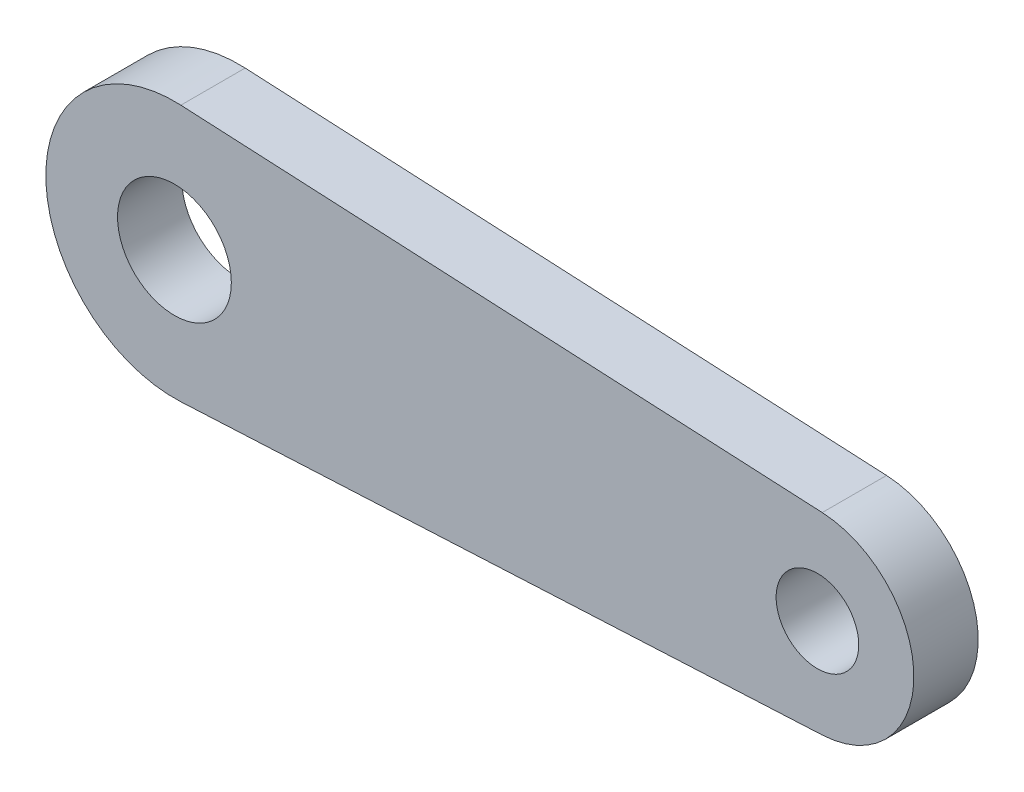
ISO-10303-21;
HEADER;
FILE_DESCRIPTION(('STEP AP214'),'2;1');
FILE_NAME('part.step','',(''),(''),'','','');
FILE_SCHEMA(('AUTOMOTIVE_DESIGN { 1 0 10303 214 1 1 1 1 }'));
ENDSEC;
DATA;
#1=APPLICATION_CONTEXT('core data for automotive mechanical design processes');
#2=APPLICATION_PROTOCOL_DEFINITION('international standard','automotive_design',2000,#1);
#3=PRODUCT_CONTEXT('',#1,'mechanical');
#4=PRODUCT('Part','Part','',(#3));
#5=PRODUCT_RELATED_PRODUCT_CATEGORY('part','',(#4));
#6=PRODUCT_DEFINITION_FORMATION('','',#4);
#7=PRODUCT_DEFINITION_CONTEXT('part definition',#1,'design');
#8=PRODUCT_DEFINITION('design','',#6,#7);
#9=PRODUCT_DEFINITION_SHAPE('','',#8);
#10=(LENGTH_UNIT() NAMED_UNIT(*) SI_UNIT(.MILLI.,.METRE.));
#11=(NAMED_UNIT(*) PLANE_ANGLE_UNIT() SI_UNIT($,.RADIAN.));
#12=(NAMED_UNIT(*) SI_UNIT($,.STERADIAN.) SOLID_ANGLE_UNIT());
#13=UNCERTAINTY_MEASURE_WITH_UNIT(LENGTH_MEASURE(1.E-05),#10,'distance_accuracy_value','');
#14=(GEOMETRIC_REPRESENTATION_CONTEXT(3) GLOBAL_UNCERTAINTY_ASSIGNED_CONTEXT((#13)) GLOBAL_UNIT_ASSIGNED_CONTEXT((#10,
#11,#12)) REPRESENTATION_CONTEXT('',''));
#15=CARTESIAN_POINT('',(0.,0.,0.));
#16=DIRECTION('',(0.,0.,1.));
#17=DIRECTION('',(1.,0.,0.));
#18=AXIS2_PLACEMENT_3D('',#15,#16,#17);
#19=CARTESIAN_POINT('',(25.4,0.,2.54));
#20=DIRECTION('',(0.,0.,-1.));
#21=DIRECTION('',(-1.,0.,0.));
#22=AXIS2_PLACEMENT_3D('',#19,#20,#21);
#23=PLANE('',#22);
#24=CARTESIAN_POINT('',(0.,0.,2.54));
#25=DIRECTION('',(0.,0.,1.));
#26=DIRECTION('',(1.,0.,0.));
#27=AXIS2_PLACEMENT_3D('',#24,#25,#26);
#28=CIRCLE('',#27,2.24789999999999);
#29=CARTESIAN_POINT('',(2.24789999999999,0.,2.54));
#30=VERTEX_POINT('',#29);
#31=EDGE_CURVE('E113',#30,#30,#28,.T.);
#32=ORIENTED_EDGE('',*,*,#31,.F.);
#33=EDGE_LOOP('',(#32));
#34=FACE_BOUND('',#33,.T.);
#35=CARTESIAN_POINT('',(25.4,0.,2.54));
#36=DIRECTION('',(0.,0.,1.));
#37=DIRECTION('',(-1.,0.,0.));
#38=AXIS2_PLACEMENT_3D('',#35,#36,#37);
#39=CIRCLE('',#38,3.81);
#40=CARTESIAN_POINT('',(25.5905,-3.80523451971097,2.54));
#41=VERTEX_POINT('',#40);
#42=CARTESIAN_POINT('',(25.5905,3.80523451971097,2.54));
#43=VERTEX_POINT('',#42);
#44=EDGE_CURVE('E85',#41,#43,#39,.T.);
#45=ORIENTED_EDGE('',*,*,#44,.T.);
#46=DIRECTION('',(-0.998749217771909,0.0500000000000001,0.));
#47=VECTOR('',#46,1.);
#48=CARTESIAN_POINT('',(0.254,5.0736460262813,2.54));
#49=LINE('',#48,#47);
#50=CARTESIAN_POINT('',(0.254000000000001,5.0736460262813,2.54));
#51=VERTEX_POINT('',#50);
#52=EDGE_CURVE('E80',#43,#51,#49,.T.);
#53=ORIENTED_EDGE('',*,*,#52,.T.);
#54=CARTESIAN_POINT('',(0.,0.,2.54));
#55=DIRECTION('',(0.,0.,1.));
#56=DIRECTION('',(1.,0.,0.));
#57=AXIS2_PLACEMENT_3D('',#54,#55,#56);
#58=CIRCLE('',#57,5.08);
#59=CARTESIAN_POINT('',(0.254,-5.0736460262813,2.54));
#60=VERTEX_POINT('',#59);
#61=EDGE_CURVE('E83',#51,#60,#58,.T.);
#62=ORIENTED_EDGE('',*,*,#61,.T.);
#63=DIRECTION('',(0.998749217771909,0.0500000000000001,0.));
#64=VECTOR('',#63,1.);
#65=CARTESIAN_POINT('',(0.254,-5.0736460262813,2.54));
#66=LINE('',#65,#64);
#67=EDGE_CURVE('E50',#60,#41,#66,.T.);
#68=ORIENTED_EDGE('',*,*,#67,.T.);
#69=EDGE_LOOP('',(#45,#53,#62,#68));
#70=FACE_BOUND('',#69,.T.);
#71=CARTESIAN_POINT('',(25.4,0.,2.54));
#72=DIRECTION('',(0.,0.,1.));
#73=DIRECTION('',(1.,0.,0.));
#74=AXIS2_PLACEMENT_3D('',#71,#72,#73);
#75=CIRCLE('',#74,1.63195);
#76=CARTESIAN_POINT('',(27.03195,0.,2.54));
#77=VERTEX_POINT('',#76);
#78=EDGE_CURVE('E119',#77,#77,#75,.T.);
#79=ORIENTED_EDGE('',*,*,#78,.F.);
#80=EDGE_LOOP('',(#79));
#81=FACE_BOUND('',#80,.T.);
#82=ADVANCED_FACE('F33',(#34,#70,#81),#23,.F.);
#83=CARTESIAN_POINT('',(25.4,0.,2.54));
#84=DIRECTION('',(0.,0.,-1.));
#85=DIRECTION('',(-1.,0.,0.));
#86=AXIS2_PLACEMENT_3D('',#83,#84,#85);
#87=CYLINDRICAL_SURFACE('',#86,3.81);
#88=CARTESIAN_POINT('',(25.4,0.,0.));
#89=DIRECTION('',(0.,0.,1.));
#90=DIRECTION('',(-1.,0.,0.));
#91=AXIS2_PLACEMENT_3D('',#88,#89,#90);
#92=CIRCLE('',#91,3.81);
#93=CARTESIAN_POINT('',(25.5905,-3.80523451971097,0.));
#94=VERTEX_POINT('',#93);
#95=CARTESIAN_POINT('',(25.5905,3.80523451971097,0.));
#96=VERTEX_POINT('',#95);
#97=EDGE_CURVE('E97',#94,#96,#92,.T.);
#98=ORIENTED_EDGE('',*,*,#97,.T.);
#99=DIRECTION('',(0.,0.,-1.));
#100=VECTOR('',#99,1.);
#101=CARTESIAN_POINT('',(25.5905,3.80523451971097,2.54));
#102=LINE('',#101,#100);
#103=EDGE_CURVE('E11',#43,#96,#102,.T.);
#104=ORIENTED_EDGE('',*,*,#103,.F.);
#105=ORIENTED_EDGE('',*,*,#44,.F.);
#106=DIRECTION('',(0.,0.,-1.));
#107=VECTOR('',#106,1.);
#108=CARTESIAN_POINT('',(25.5905,-3.80523451971097,2.54));
#109=LINE('',#108,#107);
#110=EDGE_CURVE('E93',#41,#94,#109,.T.);
#111=ORIENTED_EDGE('',*,*,#110,.T.);
#112=EDGE_LOOP('',(#98,#104,#105,#111));
#113=FACE_BOUND('',#112,.T.);
#114=ADVANCED_FACE('F35',(#113),#87,.T.);
#115=CARTESIAN_POINT('',(0.254,5.0736460262813,2.54));
#116=DIRECTION('',(-0.0500000000000001,-0.998749217771909,0.));
#117=DIRECTION('',(0.998749217771909,-0.0500000000000001,0.));
#118=AXIS2_PLACEMENT_3D('',#115,#116,#117);
#119=PLANE('',#118);
#120=DIRECTION('',(-0.998749217771909,0.0500000000000001,0.));
#121=VECTOR('',#120,1.);
#122=CARTESIAN_POINT('',(0.254,5.0736460262813,0.));
#123=LINE('',#122,#121);
#124=CARTESIAN_POINT('',(0.254000000000001,5.0736460262813,0.));
#125=VERTEX_POINT('',#124);
#126=EDGE_CURVE('E89',#96,#125,#123,.T.);
#127=ORIENTED_EDGE('',*,*,#126,.T.);
#128=DIRECTION('',(0.,0.,-1.));
#129=VECTOR('',#128,1.);
#130=CARTESIAN_POINT('',(0.254000000000001,5.0736460262813,2.54));
#131=LINE('',#130,#129);
#132=EDGE_CURVE('E42',#51,#125,#131,.T.);
#133=ORIENTED_EDGE('',*,*,#132,.F.);
#134=ORIENTED_EDGE('',*,*,#52,.F.);
#135=ORIENTED_EDGE('',*,*,#103,.T.);
#136=EDGE_LOOP('',(#127,#133,#134,#135));
#137=FACE_BOUND('',#136,.T.);
#138=ADVANCED_FACE('F88',(#137),#119,.F.);
#139=CARTESIAN_POINT('',(0.,0.,2.54));
#140=DIRECTION('',(0.,0.,-1.));
#141=DIRECTION('',(-1.,0.,0.));
#142=AXIS2_PLACEMENT_3D('',#139,#140,#141);
#143=CYLINDRICAL_SURFACE('',#142,5.08);
#144=CARTESIAN_POINT('',(0.,0.,0.));
#145=DIRECTION('',(0.,0.,1.));
#146=DIRECTION('',(1.,0.,0.));
#147=AXIS2_PLACEMENT_3D('',#144,#145,#146);
#148=CIRCLE('',#147,5.08);
#149=CARTESIAN_POINT('',(0.254,-5.0736460262813,0.));
#150=VERTEX_POINT('',#149);
#151=EDGE_CURVE('E67',#125,#150,#148,.T.);
#152=ORIENTED_EDGE('',*,*,#151,.T.);
#153=DIRECTION('',(0.,0.,-1.));
#154=VECTOR('',#153,1.);
#155=CARTESIAN_POINT('',(0.254,-5.0736460262813,2.54));
#156=LINE('',#155,#154);
#157=EDGE_CURVE('E90',#60,#150,#156,.T.);
#158=ORIENTED_EDGE('',*,*,#157,.F.);
#159=ORIENTED_EDGE('',*,*,#61,.F.);
#160=ORIENTED_EDGE('',*,*,#132,.T.);
#161=EDGE_LOOP('',(#152,#158,#159,#160));
#162=FACE_BOUND('',#161,.T.);
#163=ADVANCED_FACE('F91',(#162),#143,.T.);
#164=CARTESIAN_POINT('',(0.254,-5.0736460262813,2.54));
#165=DIRECTION('',(-0.0500000000000001,0.998749217771909,0.));
#166=DIRECTION('',(-0.998749217771909,-0.0500000000000001,0.));
#167=AXIS2_PLACEMENT_3D('',#164,#165,#166);
#168=PLANE('',#167);
#169=DIRECTION('',(0.998749217771909,0.0500000000000001,0.));
#170=VECTOR('',#169,1.);
#171=CARTESIAN_POINT('',(0.254,-5.0736460262813,0.));
#172=LINE('',#171,#170);
#173=EDGE_CURVE('E73',#150,#94,#172,.T.);
#174=ORIENTED_EDGE('',*,*,#173,.T.);
#175=ORIENTED_EDGE('',*,*,#110,.F.);
#176=ORIENTED_EDGE('',*,*,#67,.F.);
#177=ORIENTED_EDGE('',*,*,#157,.T.);
#178=EDGE_LOOP('',(#174,#175,#176,#177));
#179=FACE_BOUND('',#178,.T.);
#180=ADVANCED_FACE('F105',(#179),#168,.F.);
#181=CARTESIAN_POINT('',(25.4,0.,0.));
#182=DIRECTION('',(0.,0.,-1.));
#183=DIRECTION('',(-1.,0.,0.));
#184=AXIS2_PLACEMENT_3D('',#181,#182,#183);
#185=PLANE('',#184);
#186=CARTESIAN_POINT('',(25.4,0.,0.));
#187=DIRECTION('',(0.,0.,-1.));
#188=DIRECTION('',(-1.,0.,0.));
#189=AXIS2_PLACEMENT_3D('',#186,#187,#188);
#190=CIRCLE('',#189,1.63195);
#191=CARTESIAN_POINT('',(23.76805,0.,0.));
#192=VERTEX_POINT('',#191);
#193=EDGE_CURVE('E116',#192,#192,#190,.T.);
#194=ORIENTED_EDGE('',*,*,#193,.F.);
#195=EDGE_LOOP('',(#194));
#196=FACE_BOUND('',#195,.T.);
#197=CARTESIAN_POINT('',(0.,0.,0.));
#198=DIRECTION('',(0.,0.,-1.));
#199=DIRECTION('',(-1.,0.,0.));
#200=AXIS2_PLACEMENT_3D('',#197,#198,#199);
#201=CIRCLE('',#200,2.24789999999999);
#202=CARTESIAN_POINT('',(-2.24789999999999,0.,0.));
#203=VERTEX_POINT('',#202);
#204=EDGE_CURVE('E100',#203,#203,#201,.T.);
#205=ORIENTED_EDGE('',*,*,#204,.F.);
#206=EDGE_LOOP('',(#205));
#207=FACE_BOUND('',#206,.T.);
#208=ORIENTED_EDGE('',*,*,#97,.F.);
#209=ORIENTED_EDGE('',*,*,#173,.F.);
#210=ORIENTED_EDGE('',*,*,#151,.F.);
#211=ORIENTED_EDGE('',*,*,#126,.F.);
#212=EDGE_LOOP('',(#208,#209,#210,#211));
#213=FACE_BOUND('',#212,.T.);
#214=ADVANCED_FACE('F108',(#196,#207,#213),#185,.T.);
#215=CARTESIAN_POINT('',(0.,0.,2.54));
#216=DIRECTION('',(0.,0.,1.));
#217=DIRECTION('',(1.,0.,0.));
#218=AXIS2_PLACEMENT_3D('',#215,#216,#217);
#219=CYLINDRICAL_SURFACE('',#218,2.24789999999999);
#220=ORIENTED_EDGE('',*,*,#31,.T.);
#221=EDGE_LOOP('',(#220));
#222=FACE_BOUND('',#221,.T.);
#223=ORIENTED_EDGE('',*,*,#204,.T.);
#224=EDGE_LOOP('',(#223));
#225=FACE_BOUND('',#224,.T.);
#226=ADVANCED_FACE('F134',(#222,#225),#219,.F.);
#227=CARTESIAN_POINT('',(25.4,0.,2.54));
#228=DIRECTION('',(0.,0.,1.));
#229=DIRECTION('',(1.,0.,0.));
#230=AXIS2_PLACEMENT_3D('',#227,#228,#229);
#231=CYLINDRICAL_SURFACE('',#230,1.63195);
#232=ORIENTED_EDGE('',*,*,#78,.T.);
#233=EDGE_LOOP('',(#232));
#234=FACE_BOUND('',#233,.T.);
#235=ORIENTED_EDGE('',*,*,#193,.T.);
#236=EDGE_LOOP('',(#235));
#237=FACE_BOUND('',#236,.T.);
#238=ADVANCED_FACE('F123',(#234,#237),#231,.F.);
#239=CLOSED_SHELL('',(#82,#114,#138,#163,#180,#214,#226,#238));
#240=MANIFOLD_SOLID_BREP('B2',#239);
#241=ADVANCED_BREP_SHAPE_REPRESENTATION('',(#18,#240),#14);
#242=SHAPE_DEFINITION_REPRESENTATION(#9,#241);
ENDSEC;
END-ISO-10303-21;
